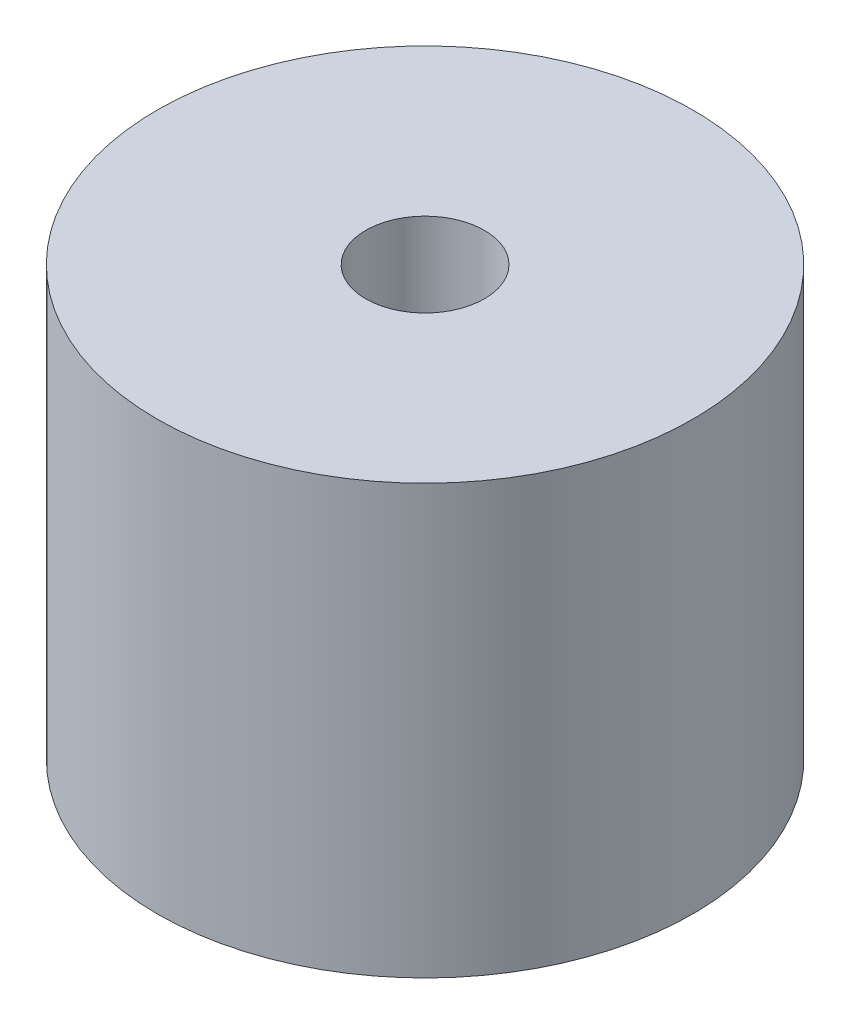
ISO-10303-21;
HEADER;
FILE_DESCRIPTION(('STEP AP214'),'2;1');
FILE_NAME('part.step','',(''),(''),'','','');
FILE_SCHEMA(('AUTOMOTIVE_DESIGN { 1 0 10303 214 1 1 1 1 }'));
ENDSEC;
DATA;
#1=APPLICATION_CONTEXT('core data for automotive mechanical design processes');
#2=APPLICATION_PROTOCOL_DEFINITION('international standard','automotive_design',2000,#1);
#3=PRODUCT_CONTEXT('',#1,'mechanical');
#4=PRODUCT('Part','Part','',(#3));
#5=PRODUCT_RELATED_PRODUCT_CATEGORY('part','',(#4));
#6=PRODUCT_DEFINITION_FORMATION('','',#4);
#7=PRODUCT_DEFINITION_CONTEXT('part definition',#1,'design');
#8=PRODUCT_DEFINITION('design','',#6,#7);
#9=PRODUCT_DEFINITION_SHAPE('','',#8);
#10=(LENGTH_UNIT() NAMED_UNIT(*) SI_UNIT(.MILLI.,.METRE.));
#11=(NAMED_UNIT(*) PLANE_ANGLE_UNIT() SI_UNIT($,.RADIAN.));
#12=(NAMED_UNIT(*) SI_UNIT($,.STERADIAN.) SOLID_ANGLE_UNIT());
#13=UNCERTAINTY_MEASURE_WITH_UNIT(LENGTH_MEASURE(1.E-05),#10,'distance_accuracy_value','');
#14=(GEOMETRIC_REPRESENTATION_CONTEXT(3) GLOBAL_UNCERTAINTY_ASSIGNED_CONTEXT((#13)) GLOBAL_UNIT_ASSIGNED_CONTEXT((#10,
#11,#12)) REPRESENTATION_CONTEXT('',''));
#15=CARTESIAN_POINT('',(0.,0.,0.));
#16=DIRECTION('',(0.,0.,1.));
#17=DIRECTION('',(1.,0.,0.));
#18=AXIS2_PLACEMENT_3D('',#15,#16,#17);
#19=CARTESIAN_POINT('',(0.,9.6,0.));
#20=DIRECTION('',(0.,-1.,0.));
#21=DIRECTION('',(0.,0.,-1.));
#22=AXIS2_PLACEMENT_3D('',#19,#20,#21);
#23=CYLINDRICAL_SURFACE('',#22,6.);
#24=CARTESIAN_POINT('',(0.,9.6,0.));
#25=DIRECTION('',(0.,1.,0.));
#26=DIRECTION('',(0.,0.,1.));
#27=AXIS2_PLACEMENT_3D('',#24,#25,#26);
#28=CIRCLE('',#27,6.);
#29=CARTESIAN_POINT('',(0.,9.6,6.));
#30=VERTEX_POINT('',#29);
#31=EDGE_CURVE('E42',#30,#30,#28,.T.);
#32=ORIENTED_EDGE('',*,*,#31,.F.);
#33=EDGE_LOOP('',(#32));
#34=FACE_BOUND('',#33,.T.);
#35=CARTESIAN_POINT('',(0.,0.,0.));
#36=DIRECTION('',(0.,1.,0.));
#37=DIRECTION('',(0.,0.,1.));
#38=AXIS2_PLACEMENT_3D('',#35,#36,#37);
#39=CIRCLE('',#38,6.);
#40=CARTESIAN_POINT('',(0.,0.,6.));
#41=VERTEX_POINT('',#40);
#42=EDGE_CURVE('E46',#41,#41,#39,.T.);
#43=ORIENTED_EDGE('',*,*,#42,.T.);
#44=EDGE_LOOP('',(#43));
#45=FACE_BOUND('',#44,.T.);
#46=ADVANCED_FACE('F32',(#34,#45),#23,.T.);
#47=CARTESIAN_POINT('',(0.,9.6,0.));
#48=DIRECTION('',(0.,1.,0.));
#49=DIRECTION('',(0.,0.,1.));
#50=AXIS2_PLACEMENT_3D('',#47,#48,#49);
#51=PLANE('',#50);
#52=CARTESIAN_POINT('',(0.,9.6,0.));
#53=DIRECTION('',(0.,1.,0.));
#54=DIRECTION('',(0.,0.,1.));
#55=AXIS2_PLACEMENT_3D('',#52,#53,#54);
#56=CIRCLE('',#55,1.33);
#57=CARTESIAN_POINT('',(0.,9.6,1.33));
#58=VERTEX_POINT('',#57);
#59=EDGE_CURVE('E52',#58,#58,#56,.T.);
#60=ORIENTED_EDGE('',*,*,#59,.F.);
#61=EDGE_LOOP('',(#60));
#62=FACE_BOUND('',#61,.T.);
#63=ORIENTED_EDGE('',*,*,#31,.T.);
#64=EDGE_LOOP('',(#63));
#65=FACE_BOUND('',#64,.T.);
#66=ADVANCED_FACE('F85',(#62,#65),#51,.T.);
#67=CARTESIAN_POINT('',(0.,0.,0.));
#68=DIRECTION('',(0.,1.,0.));
#69=DIRECTION('',(0.,0.,1.));
#70=AXIS2_PLACEMENT_3D('',#67,#68,#69);
#71=PLANE('',#70);
#72=CARTESIAN_POINT('',(3.75,0.,0.));
#73=DIRECTION('',(0.,1.,0.));
#74=DIRECTION('',(0.,0.,1.));
#75=AXIS2_PLACEMENT_3D('',#72,#73,#74);
#76=CIRCLE('',#75,0.3);
#77=CARTESIAN_POINT('',(3.75,0.,0.300000000000004));
#78=VERTEX_POINT('',#77);
#79=EDGE_CURVE('E10',#78,#78,#76,.F.);
#80=ORIENTED_EDGE('',*,*,#79,.F.);
#81=EDGE_LOOP('',(#80));
#82=FACE_BOUND('',#81,.T.);
#83=CARTESIAN_POINT('',(-3.75,0.,0.));
#84=DIRECTION('',(0.,1.,0.));
#85=DIRECTION('',(0.,0.,1.));
#86=AXIS2_PLACEMENT_3D('',#83,#84,#85);
#87=CIRCLE('',#86,0.3);
#88=CARTESIAN_POINT('',(-3.75,0.,0.3));
#89=VERTEX_POINT('',#88);
#90=EDGE_CURVE('E38',#89,#89,#87,.F.);
#91=ORIENTED_EDGE('',*,*,#90,.F.);
#92=EDGE_LOOP('',(#91));
#93=FACE_BOUND('',#92,.T.);
#94=ORIENTED_EDGE('',*,*,#42,.F.);
#95=EDGE_LOOP('',(#94));
#96=FACE_BOUND('',#95,.T.);
#97=ADVANCED_FACE('F90',(#82,#93,#96),#71,.F.);
#98=CARTESIAN_POINT('',(0.,6.6,0.));
#99=DIRECTION('',(0.,1.,0.));
#100=DIRECTION('',(0.,0.,1.));
#101=AXIS2_PLACEMENT_3D('',#98,#99,#100);
#102=CYLINDRICAL_SURFACE('',#101,1.33);
#103=CARTESIAN_POINT('',(0.,7.6,0.));
#104=DIRECTION('',(0.,1.,0.));
#105=DIRECTION('',(0.,0.,1.));
#106=AXIS2_PLACEMENT_3D('',#103,#104,#105);
#107=CIRCLE('',#106,1.33);
#108=CARTESIAN_POINT('',(0.,7.6,1.33));
#109=VERTEX_POINT('',#108);
#110=EDGE_CURVE('E49',#109,#109,#107,.F.);
#111=ORIENTED_EDGE('',*,*,#110,.T.);
#112=EDGE_LOOP('',(#111));
#113=FACE_BOUND('',#112,.T.);
#114=ORIENTED_EDGE('',*,*,#59,.T.);
#115=EDGE_LOOP('',(#114));
#116=FACE_BOUND('',#115,.T.);
#117=ADVANCED_FACE('F98',(#113,#116),#102,.F.);
#118=CARTESIAN_POINT('',(0.,7.6,0.));
#119=DIRECTION('',(0.,1.,0.));
#120=DIRECTION('',(0.,0.,1.));
#121=AXIS2_PLACEMENT_3D('',#118,#119,#120);
#122=PLANE('',#121);
#123=CARTESIAN_POINT('',(0.,7.6,0.));
#124=DIRECTION('',(0.,1.,0.));
#125=DIRECTION('',(0.,0.,1.));
#126=AXIS2_PLACEMENT_3D('',#123,#124,#125);
#127=CIRCLE('',#126,5.);
#128=CARTESIAN_POINT('',(0.,7.6,5.));
#129=VERTEX_POINT('',#128);
#130=EDGE_CURVE('E53',#129,#129,#127,.T.);
#131=ORIENTED_EDGE('',*,*,#130,.F.);
#132=EDGE_LOOP('',(#131));
#133=FACE_BOUND('',#132,.T.);
#134=ORIENTED_EDGE('',*,*,#110,.F.);
#135=EDGE_LOOP('',(#134));
#136=FACE_BOUND('',#135,.T.);
#137=ADVANCED_FACE('F103',(#133,#136),#122,.F.);
#138=CARTESIAN_POINT('',(0.,7.6,0.));
#139=DIRECTION('',(0.,-1.,0.));
#140=DIRECTION('',(0.,0.,-1.));
#141=AXIS2_PLACEMENT_3D('',#138,#139,#140);
#142=CYLINDRICAL_SURFACE('',#141,5.);
#143=ORIENTED_EDGE('',*,*,#130,.T.);
#144=EDGE_LOOP('',(#143));
#145=FACE_BOUND('',#144,.T.);
#146=CARTESIAN_POINT('',(0.,6.6,0.));
#147=DIRECTION('',(0.,1.,0.));
#148=DIRECTION('',(0.,0.,1.));
#149=AXIS2_PLACEMENT_3D('',#146,#147,#148);
#150=CIRCLE('',#149,5.);
#151=CARTESIAN_POINT('',(0.,6.6,5.));
#152=VERTEX_POINT('',#151);
#153=EDGE_CURVE('E58',#152,#152,#150,.T.);
#154=ORIENTED_EDGE('',*,*,#153,.F.);
#155=EDGE_LOOP('',(#154));
#156=FACE_BOUND('',#155,.T.);
#157=ADVANCED_FACE('F111',(#145,#156),#142,.F.);
#158=CARTESIAN_POINT('',(0.,6.6,0.));
#159=DIRECTION('',(0.,1.,0.));
#160=DIRECTION('',(0.,0.,1.));
#161=AXIS2_PLACEMENT_3D('',#158,#159,#160);
#162=PLANE('',#161);
#163=ORIENTED_EDGE('',*,*,#153,.T.);
#164=EDGE_LOOP('',(#163));
#165=FACE_BOUND('',#164,.T.);
#166=ADVANCED_FACE('F108',(#165),#162,.T.);
#167=CARTESIAN_POINT('',(-3.75,-1.,0.));
#168=DIRECTION('',(0.,1.,0.));
#169=DIRECTION('',(0.,0.,1.));
#170=AXIS2_PLACEMENT_3D('',#167,#168,#169);
#171=CYLINDRICAL_SURFACE('',#170,0.3);
#172=CARTESIAN_POINT('',(-3.75,-1.,0.));
#173=DIRECTION('',(0.,-1.,0.));
#174=DIRECTION('',(0.,0.,-1.));
#175=AXIS2_PLACEMENT_3D('',#172,#173,#174);
#176=CIRCLE('',#175,0.3);
#177=CARTESIAN_POINT('',(-3.75,-1.,-0.3));
#178=VERTEX_POINT('',#177);
#179=EDGE_CURVE('E61',#178,#178,#176,.T.);
#180=ORIENTED_EDGE('',*,*,#179,.F.);
#181=EDGE_LOOP('',(#180));
#182=FACE_BOUND('',#181,.T.);
#183=ORIENTED_EDGE('',*,*,#90,.T.);
#184=EDGE_LOOP('',(#183));
#185=FACE_BOUND('',#184,.T.);
#186=ADVANCED_FACE('F81',(#182,#185),#171,.T.);
#187=CARTESIAN_POINT('',(-3.75,-1.,0.));
#188=DIRECTION('',(0.,-1.,0.));
#189=DIRECTION('',(0.,0.,-1.));
#190=AXIS2_PLACEMENT_3D('',#187,#188,#189);
#191=PLANE('',#190);
#192=ORIENTED_EDGE('',*,*,#179,.T.);
#193=EDGE_LOOP('',(#192));
#194=FACE_BOUND('',#193,.T.);
#195=ADVANCED_FACE('F74',(#194),#191,.T.);
#196=CARTESIAN_POINT('',(3.75,-1.,0.));
#197=DIRECTION('',(0.,1.,0.));
#198=DIRECTION('',(0.,0.,1.));
#199=AXIS2_PLACEMENT_3D('',#196,#197,#198);
#200=CYLINDRICAL_SURFACE('',#199,0.3);
#201=CARTESIAN_POINT('',(3.75,-1.,0.));
#202=DIRECTION('',(0.,-1.,0.));
#203=DIRECTION('',(0.,0.,1.));
#204=AXIS2_PLACEMENT_3D('',#201,#202,#203);
#205=CIRCLE('',#204,0.3);
#206=CARTESIAN_POINT('',(3.75,-1.,0.300000000000004));
#207=VERTEX_POINT('',#206);
#208=EDGE_CURVE('E66',#207,#207,#205,.T.);
#209=ORIENTED_EDGE('',*,*,#208,.F.);
#210=EDGE_LOOP('',(#209));
#211=FACE_BOUND('',#210,.T.);
#212=ORIENTED_EDGE('',*,*,#79,.T.);
#213=EDGE_LOOP('',(#212));
#214=FACE_BOUND('',#213,.T.);
#215=ADVANCED_FACE('F72',(#211,#214),#200,.T.);
#216=CARTESIAN_POINT('',(3.75,-1.,0.));
#217=DIRECTION('',(0.,1.,0.));
#218=DIRECTION('',(0.,0.,1.));
#219=AXIS2_PLACEMENT_3D('',#216,#217,#218);
#220=PLANE('',#219);
#221=ORIENTED_EDGE('',*,*,#208,.T.);
#222=EDGE_LOOP('',(#221));
#223=FACE_BOUND('',#222,.T.);
#224=ADVANCED_FACE('F70',(#223),#220,.F.);
#225=CLOSED_SHELL('',(#46,#66,#97,#117,#137,#157,#166,#186,#195,#215,#224));
#226=MANIFOLD_SOLID_BREP('B2',#225);
#227=ADVANCED_BREP_SHAPE_REPRESENTATION('',(#18,#226),#14);
#228=SHAPE_DEFINITION_REPRESENTATION(#9,#227);
ENDSEC;
END-ISO-10303-21;
